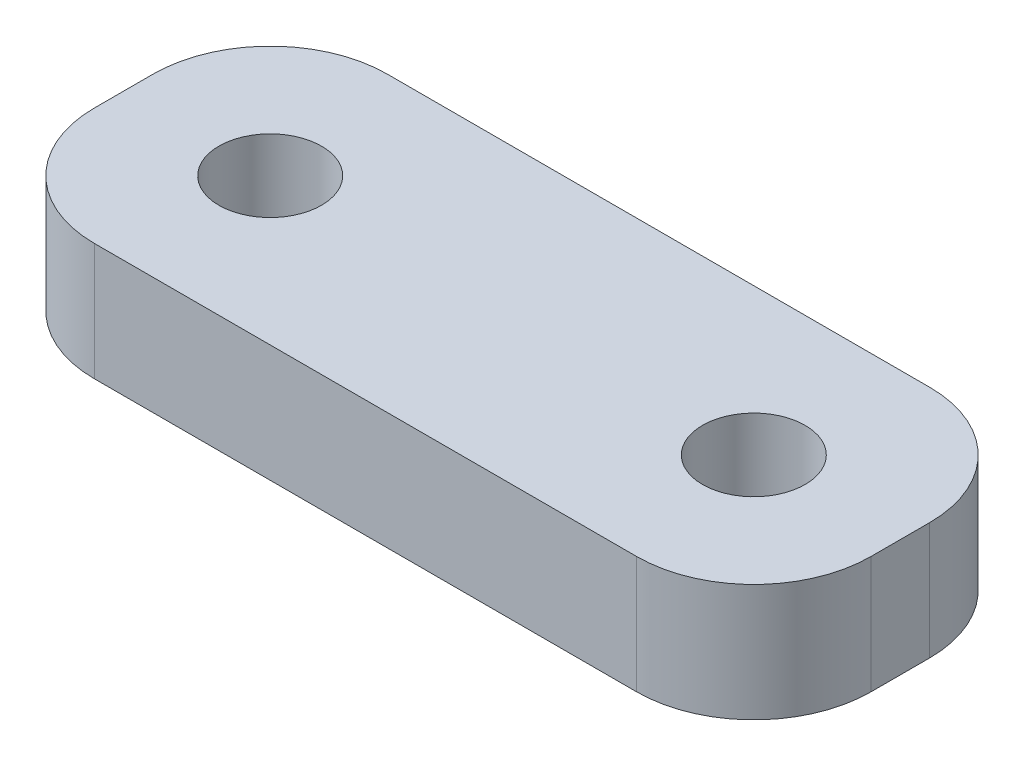
ISO-10303-21;
HEADER;
FILE_DESCRIPTION(('STEP AP214'),'2;1');
FILE_NAME('part.step','',(''),(''),'','','');
FILE_SCHEMA(('AUTOMOTIVE_DESIGN { 1 0 10303 214 1 1 1 1 }'));
ENDSEC;
DATA;
#1=APPLICATION_CONTEXT('core data for automotive mechanical design processes');
#2=APPLICATION_PROTOCOL_DEFINITION('international standard','automotive_design',2000,#1);
#3=PRODUCT_CONTEXT('',#1,'mechanical');
#4=PRODUCT('Part','Part','',(#3));
#5=PRODUCT_RELATED_PRODUCT_CATEGORY('part','',(#4));
#6=PRODUCT_DEFINITION_FORMATION('','',#4);
#7=PRODUCT_DEFINITION_CONTEXT('part definition',#1,'design');
#8=PRODUCT_DEFINITION('design','',#6,#7);
#9=PRODUCT_DEFINITION_SHAPE('','',#8);
#10=(LENGTH_UNIT() NAMED_UNIT(*) SI_UNIT(.MILLI.,.METRE.));
#11=(NAMED_UNIT(*) PLANE_ANGLE_UNIT() SI_UNIT($,.RADIAN.));
#12=(NAMED_UNIT(*) SI_UNIT($,.STERADIAN.) SOLID_ANGLE_UNIT());
#13=UNCERTAINTY_MEASURE_WITH_UNIT(LENGTH_MEASURE(1.E-05),#10,'distance_accuracy_value','');
#14=(GEOMETRIC_REPRESENTATION_CONTEXT(3) GLOBAL_UNCERTAINTY_ASSIGNED_CONTEXT((#13)) GLOBAL_UNIT_ASSIGNED_CONTEXT((#10,
#11,#12)) REPRESENTATION_CONTEXT('',''));
#15=CARTESIAN_POINT('',(0.,0.,0.));
#16=DIRECTION('',(0.,0.,1.));
#17=DIRECTION('',(1.,0.,0.));
#18=AXIS2_PLACEMENT_3D('',#15,#16,#17);
#19=CARTESIAN_POINT('',(0.,4.,0.));
#20=DIRECTION('',(0.,-1.,0.));
#21=DIRECTION('',(0.,0.,-1.));
#22=AXIS2_PLACEMENT_3D('',#19,#20,#21);
#23=PLANE('',#22);
#24=DIRECTION('',(0.,0.,-1.));
#25=VECTOR('',#24,1.);
#26=CARTESIAN_POINT('',(26.5,4.,0.));
#27=LINE('',#26,#25);
#28=CARTESIAN_POINT('',(26.5,4.,-4.));
#29=VERTEX_POINT('',#28);
#30=CARTESIAN_POINT('',(26.5,4.,-6.00000000000001));
#31=VERTEX_POINT('',#30);
#32=EDGE_CURVE('E180',#29,#31,#27,.T.);
#33=ORIENTED_EDGE('',*,*,#32,.T.);
#34=CARTESIAN_POINT('',(22.5,4.,-6.00000000000001));
#35=DIRECTION('',(0.,-1.,0.));
#36=DIRECTION('',(0.,0.,-1.));
#37=AXIS2_PLACEMENT_3D('',#34,#35,#36);
#38=CIRCLE('',#37,4.);
#39=CARTESIAN_POINT('',(22.5,4.,-10.));
#40=VERTEX_POINT('',#39);
#41=EDGE_CURVE('E154',#31,#40,#38,.F.);
#42=ORIENTED_EDGE('',*,*,#41,.T.);
#43=DIRECTION('',(-1.,0.,0.));
#44=VECTOR('',#43,1.);
#45=CARTESIAN_POINT('',(0.,4.,-10.));
#46=LINE('',#45,#44);
#47=CARTESIAN_POINT('',(4.,4.,-10.));
#48=VERTEX_POINT('',#47);
#49=EDGE_CURVE('E127',#40,#48,#46,.T.);
#50=ORIENTED_EDGE('',*,*,#49,.T.);
#51=CARTESIAN_POINT('',(4.,4.,-6.00000000000001));
#52=DIRECTION('',(0.,-1.,0.));
#53=DIRECTION('',(0.,0.,-1.));
#54=AXIS2_PLACEMENT_3D('',#51,#52,#53);
#55=CIRCLE('',#54,4.);
#56=CARTESIAN_POINT('',(0.,4.,-6.00000000000001));
#57=VERTEX_POINT('',#56);
#58=EDGE_CURVE('E151',#48,#57,#55,.F.);
#59=ORIENTED_EDGE('',*,*,#58,.T.);
#60=DIRECTION('',(0.,0.,1.));
#61=VECTOR('',#60,1.);
#62=CARTESIAN_POINT('',(0.,4.,0.));
#63=LINE('',#62,#61);
#64=CARTESIAN_POINT('',(0.,4.,-4.));
#65=VERTEX_POINT('',#64);
#66=EDGE_CURVE('E133',#57,#65,#63,.T.);
#67=ORIENTED_EDGE('',*,*,#66,.T.);
#68=CARTESIAN_POINT('',(4.,4.,-4.));
#69=DIRECTION('',(0.,-1.,0.));
#70=DIRECTION('',(0.,0.,-1.));
#71=AXIS2_PLACEMENT_3D('',#68,#69,#70);
#72=CIRCLE('',#71,4.);
#73=CARTESIAN_POINT('',(4.,4.,0.));
#74=VERTEX_POINT('',#73);
#75=EDGE_CURVE('E64',#65,#74,#72,.F.);
#76=ORIENTED_EDGE('',*,*,#75,.T.);
#77=DIRECTION('',(1.,0.,0.));
#78=VECTOR('',#77,1.);
#79=CARTESIAN_POINT('',(0.,4.,0.));
#80=LINE('',#79,#78);
#81=CARTESIAN_POINT('',(22.5,4.,0.));
#82=VERTEX_POINT('',#81);
#83=EDGE_CURVE('E136',#74,#82,#80,.T.);
#84=ORIENTED_EDGE('',*,*,#83,.T.);
#85=CARTESIAN_POINT('',(22.5,4.,-4.));
#86=DIRECTION('',(0.,-1.,0.));
#87=DIRECTION('',(0.,0.,-1.));
#88=AXIS2_PLACEMENT_3D('',#85,#86,#87);
#89=CIRCLE('',#88,4.);
#90=EDGE_CURVE('E153',#82,#29,#89,.F.);
#91=ORIENTED_EDGE('',*,*,#90,.T.);
#92=EDGE_LOOP('',(#33,#42,#50,#59,#67,#76,#84,#91));
#93=FACE_BOUND('',#92,.T.);
#94=CARTESIAN_POINT('',(5.,4.,-5.));
#95=DIRECTION('',(0.,1.,0.));
#96=DIRECTION('',(0.,0.,1.));
#97=AXIS2_PLACEMENT_3D('',#94,#95,#96);
#98=CIRCLE('',#97,1.75000000000001);
#99=CARTESIAN_POINT('',(5.,4.,-3.24999999999999));
#100=VERTEX_POINT('',#99);
#101=EDGE_CURVE('E173',#100,#100,#98,.T.);
#102=ORIENTED_EDGE('',*,*,#101,.F.);
#103=EDGE_LOOP('',(#102));
#104=FACE_BOUND('',#103,.T.);
#105=CARTESIAN_POINT('',(21.5,4.,-5.));
#106=DIRECTION('',(0.,1.,0.));
#107=DIRECTION('',(0.,0.,1.));
#108=AXIS2_PLACEMENT_3D('',#105,#106,#107);
#109=CIRCLE('',#108,1.75000000000001);
#110=CARTESIAN_POINT('',(21.5,4.,-3.25));
#111=VERTEX_POINT('',#110);
#112=EDGE_CURVE('E184',#111,#111,#109,.T.);
#113=ORIENTED_EDGE('',*,*,#112,.F.);
#114=EDGE_LOOP('',(#113));
#115=FACE_BOUND('',#114,.T.);
#116=ADVANCED_FACE('F39',(#93,#104,#115),#23,.F.);
#117=CARTESIAN_POINT('',(0.,0.,0.));
#118=DIRECTION('',(0.,-1.,0.));
#119=DIRECTION('',(0.,0.,-1.));
#120=AXIS2_PLACEMENT_3D('',#117,#118,#119);
#121=PLANE('',#120);
#122=CARTESIAN_POINT('',(5.,0.,-5.));
#123=DIRECTION('',(0.,1.,0.));
#124=DIRECTION('',(0.,0.,1.));
#125=AXIS2_PLACEMENT_3D('',#122,#123,#124);
#126=CIRCLE('',#125,1.75000000000001);
#127=CARTESIAN_POINT('',(5.,0.,-3.24999999999999));
#128=VERTEX_POINT('',#127);
#129=EDGE_CURVE('E182',#128,#128,#126,.T.);
#130=ORIENTED_EDGE('',*,*,#129,.T.);
#131=EDGE_LOOP('',(#130));
#132=FACE_BOUND('',#131,.T.);
#133=DIRECTION('',(-1.,0.,0.));
#134=VECTOR('',#133,1.);
#135=CARTESIAN_POINT('',(0.,0.,-10.));
#136=LINE('',#135,#134);
#137=CARTESIAN_POINT('',(22.5,0.,-10.));
#138=VERTEX_POINT('',#137);
#139=CARTESIAN_POINT('',(4.,0.,-10.));
#140=VERTEX_POINT('',#139);
#141=EDGE_CURVE('E125',#138,#140,#136,.T.);
#142=ORIENTED_EDGE('',*,*,#141,.F.);
#143=CARTESIAN_POINT('',(22.5,0.,-6.00000000000001));
#144=DIRECTION('',(0.,-1.,0.));
#145=DIRECTION('',(0.,0.,-1.));
#146=AXIS2_PLACEMENT_3D('',#143,#144,#145);
#147=CIRCLE('',#146,4.);
#148=CARTESIAN_POINT('',(26.5,0.,-6.00000000000001));
#149=VERTEX_POINT('',#148);
#150=EDGE_CURVE('E106',#138,#149,#147,.T.);
#151=ORIENTED_EDGE('',*,*,#150,.T.);
#152=DIRECTION('',(0.,0.,-1.));
#153=VECTOR('',#152,1.);
#154=CARTESIAN_POINT('',(26.5,0.,0.));
#155=LINE('',#154,#153);
#156=CARTESIAN_POINT('',(26.5,0.,-4.));
#157=VERTEX_POINT('',#156);
#158=EDGE_CURVE('E132',#157,#149,#155,.T.);
#159=ORIENTED_EDGE('',*,*,#158,.F.);
#160=CARTESIAN_POINT('',(22.5,0.,-4.));
#161=DIRECTION('',(0.,-1.,0.));
#162=DIRECTION('',(0.,0.,-1.));
#163=AXIS2_PLACEMENT_3D('',#160,#161,#162);
#164=CIRCLE('',#163,4.);
#165=CARTESIAN_POINT('',(22.5,0.,0.));
#166=VERTEX_POINT('',#165);
#167=EDGE_CURVE('E116',#157,#166,#164,.T.);
#168=ORIENTED_EDGE('',*,*,#167,.T.);
#169=DIRECTION('',(1.,0.,0.));
#170=VECTOR('',#169,1.);
#171=CARTESIAN_POINT('',(0.,0.,0.));
#172=LINE('',#171,#170);
#173=CARTESIAN_POINT('',(4.,0.,0.));
#174=VERTEX_POINT('',#173);
#175=EDGE_CURVE('E138',#174,#166,#172,.T.);
#176=ORIENTED_EDGE('',*,*,#175,.F.);
#177=CARTESIAN_POINT('',(4.,0.,-4.));
#178=DIRECTION('',(0.,-1.,0.));
#179=DIRECTION('',(0.,0.,-1.));
#180=AXIS2_PLACEMENT_3D('',#177,#178,#179);
#181=CIRCLE('',#180,4.);
#182=CARTESIAN_POINT('',(0.,0.,-4.));
#183=VERTEX_POINT('',#182);
#184=EDGE_CURVE('E130',#174,#183,#181,.T.);
#185=ORIENTED_EDGE('',*,*,#184,.T.);
#186=DIRECTION('',(0.,0.,1.));
#187=VECTOR('',#186,1.);
#188=CARTESIAN_POINT('',(0.,0.,0.));
#189=LINE('',#188,#187);
#190=CARTESIAN_POINT('',(0.,0.,-6.00000000000001));
#191=VERTEX_POINT('',#190);
#192=EDGE_CURVE('E167',#191,#183,#189,.T.);
#193=ORIENTED_EDGE('',*,*,#192,.F.);
#194=CARTESIAN_POINT('',(4.,0.,-6.00000000000001));
#195=DIRECTION('',(0.,-1.,0.));
#196=DIRECTION('',(0.,0.,-1.));
#197=AXIS2_PLACEMENT_3D('',#194,#195,#196);
#198=CIRCLE('',#197,4.);
#199=EDGE_CURVE('E135',#191,#140,#198,.T.);
#200=ORIENTED_EDGE('',*,*,#199,.T.);
#201=EDGE_LOOP('',(#142,#151,#159,#168,#176,#185,#193,#200));
#202=FACE_BOUND('',#201,.T.);
#203=CARTESIAN_POINT('',(21.5,0.,-5.));
#204=DIRECTION('',(0.,1.,0.));
#205=DIRECTION('',(0.,0.,1.));
#206=AXIS2_PLACEMENT_3D('',#203,#204,#205);
#207=CIRCLE('',#206,1.75000000000001);
#208=CARTESIAN_POINT('',(21.5,0.,-3.25));
#209=VERTEX_POINT('',#208);
#210=EDGE_CURVE('E186',#209,#209,#207,.T.);
#211=ORIENTED_EDGE('',*,*,#210,.T.);
#212=EDGE_LOOP('',(#211));
#213=FACE_BOUND('',#212,.T.);
#214=ADVANCED_FACE('F128',(#132,#202,#213),#121,.T.);
#215=CARTESIAN_POINT('',(0.,4.,0.));
#216=DIRECTION('',(1.,0.,0.));
#217=DIRECTION('',(0.,0.,-1.));
#218=AXIS2_PLACEMENT_3D('',#215,#216,#217);
#219=PLANE('',#218);
#220=ORIENTED_EDGE('',*,*,#66,.F.);
#221=DIRECTION('',(0.,-1.,0.));
#222=VECTOR('',#221,1.);
#223=CARTESIAN_POINT('',(0.,4.,-6.00000000000001));
#224=LINE('',#223,#222);
#225=EDGE_CURVE('E11',#57,#191,#224,.T.);
#226=ORIENTED_EDGE('',*,*,#225,.T.);
#227=ORIENTED_EDGE('',*,*,#192,.T.);
#228=DIRECTION('',(0.,-1.,0.));
#229=VECTOR('',#228,1.);
#230=CARTESIAN_POINT('',(0.,4.,-4.));
#231=LINE('',#230,#229);
#232=EDGE_CURVE('E50',#183,#65,#231,.F.);
#233=ORIENTED_EDGE('',*,*,#232,.T.);
#234=EDGE_LOOP('',(#220,#226,#227,#233));
#235=FACE_BOUND('',#234,.T.);
#236=ADVANCED_FACE('F163',(#235),#219,.F.);
#237=CARTESIAN_POINT('',(0.,4.,0.));
#238=DIRECTION('',(0.,0.,-1.));
#239=DIRECTION('',(-1.,0.,0.));
#240=AXIS2_PLACEMENT_3D('',#237,#238,#239);
#241=PLANE('',#240);
#242=ORIENTED_EDGE('',*,*,#175,.T.);
#243=DIRECTION('',(0.,-1.,0.));
#244=VECTOR('',#243,1.);
#245=CARTESIAN_POINT('',(22.5,4.,0.));
#246=LINE('',#245,#244);
#247=EDGE_CURVE('E53',#166,#82,#246,.F.);
#248=ORIENTED_EDGE('',*,*,#247,.T.);
#249=ORIENTED_EDGE('',*,*,#83,.F.);
#250=DIRECTION('',(0.,-1.,0.));
#251=VECTOR('',#250,1.);
#252=CARTESIAN_POINT('',(4.,4.,0.));
#253=LINE('',#252,#251);
#254=EDGE_CURVE('E160',#74,#174,#253,.T.);
#255=ORIENTED_EDGE('',*,*,#254,.T.);
#256=EDGE_LOOP('',(#242,#248,#249,#255));
#257=FACE_BOUND('',#256,.T.);
#258=ADVANCED_FACE('F175',(#257),#241,.F.);
#259=CARTESIAN_POINT('',(26.5,4.,0.));
#260=DIRECTION('',(-1.,0.,0.));
#261=DIRECTION('',(0.,0.,1.));
#262=AXIS2_PLACEMENT_3D('',#259,#260,#261);
#263=PLANE('',#262);
#264=ORIENTED_EDGE('',*,*,#158,.T.);
#265=DIRECTION('',(0.,-1.,0.));
#266=VECTOR('',#265,1.);
#267=CARTESIAN_POINT('',(26.5,4.,-6.00000000000001));
#268=LINE('',#267,#266);
#269=EDGE_CURVE('E112',#149,#31,#268,.F.);
#270=ORIENTED_EDGE('',*,*,#269,.T.);
#271=ORIENTED_EDGE('',*,*,#32,.F.);
#272=DIRECTION('',(0.,-1.,0.));
#273=VECTOR('',#272,1.);
#274=CARTESIAN_POINT('',(26.5,4.,-4.));
#275=LINE('',#274,#273);
#276=EDGE_CURVE('E119',#29,#157,#275,.T.);
#277=ORIENTED_EDGE('',*,*,#276,.T.);
#278=EDGE_LOOP('',(#264,#270,#271,#277));
#279=FACE_BOUND('',#278,.T.);
#280=ADVANCED_FACE('F209',(#279),#263,.F.);
#281=CARTESIAN_POINT('',(0.,4.,-10.));
#282=DIRECTION('',(0.,0.,1.));
#283=DIRECTION('',(1.,0.,0.));
#284=AXIS2_PLACEMENT_3D('',#281,#282,#283);
#285=PLANE('',#284);
#286=ORIENTED_EDGE('',*,*,#49,.F.);
#287=DIRECTION('',(0.,-1.,0.));
#288=VECTOR('',#287,1.);
#289=CARTESIAN_POINT('',(22.5,4.,-10.));
#290=LINE('',#289,#288);
#291=EDGE_CURVE('E109',#40,#138,#290,.T.);
#292=ORIENTED_EDGE('',*,*,#291,.T.);
#293=ORIENTED_EDGE('',*,*,#141,.T.);
#294=DIRECTION('',(0.,-1.,0.));
#295=VECTOR('',#294,1.);
#296=CARTESIAN_POINT('',(4.,4.,-10.));
#297=LINE('',#296,#295);
#298=EDGE_CURVE('E126',#140,#48,#297,.F.);
#299=ORIENTED_EDGE('',*,*,#298,.T.);
#300=EDGE_LOOP('',(#286,#292,#293,#299));
#301=FACE_BOUND('',#300,.T.);
#302=ADVANCED_FACE('F121',(#301),#285,.F.);
#303=CARTESIAN_POINT('',(5.,4.,-5.));
#304=DIRECTION('',(0.,-1.,0.));
#305=DIRECTION('',(0.,0.,-1.));
#306=AXIS2_PLACEMENT_3D('',#303,#304,#305);
#307=CYLINDRICAL_SURFACE('',#306,1.75000000000001);
#308=ORIENTED_EDGE('',*,*,#101,.T.);
#309=EDGE_LOOP('',(#308));
#310=FACE_BOUND('',#309,.T.);
#311=ORIENTED_EDGE('',*,*,#129,.F.);
#312=EDGE_LOOP('',(#311));
#313=FACE_BOUND('',#312,.T.);
#314=ADVANCED_FACE('F202',(#310,#313),#307,.F.);
#315=CARTESIAN_POINT('',(21.5,4.,-5.));
#316=DIRECTION('',(0.,-1.,0.));
#317=DIRECTION('',(0.,0.,-1.));
#318=AXIS2_PLACEMENT_3D('',#315,#316,#317);
#319=CYLINDRICAL_SURFACE('',#318,1.75000000000001);
#320=ORIENTED_EDGE('',*,*,#112,.T.);
#321=EDGE_LOOP('',(#320));
#322=FACE_BOUND('',#321,.T.);
#323=ORIENTED_EDGE('',*,*,#210,.F.);
#324=EDGE_LOOP('',(#323));
#325=FACE_BOUND('',#324,.T.);
#326=ADVANCED_FACE('F195',(#322,#325),#319,.F.);
#327=CARTESIAN_POINT('',(22.5,4.,-6.00000000000001));
#328=DIRECTION('',(0.,-1.,0.));
#329=DIRECTION('',(0.,0.,-1.));
#330=AXIS2_PLACEMENT_3D('',#327,#328,#329);
#331=CYLINDRICAL_SURFACE('',#330,4.);
#332=ORIENTED_EDGE('',*,*,#41,.F.);
#333=ORIENTED_EDGE('',*,*,#269,.F.);
#334=ORIENTED_EDGE('',*,*,#150,.F.);
#335=ORIENTED_EDGE('',*,*,#291,.F.);
#336=EDGE_LOOP('',(#332,#333,#334,#335));
#337=FACE_BOUND('',#336,.T.);
#338=ADVANCED_FACE('F108',(#337),#331,.T.);
#339=CARTESIAN_POINT('',(22.5,4.,-4.));
#340=DIRECTION('',(0.,-1.,0.));
#341=DIRECTION('',(0.,0.,-1.));
#342=AXIS2_PLACEMENT_3D('',#339,#340,#341);
#343=CYLINDRICAL_SURFACE('',#342,4.);
#344=ORIENTED_EDGE('',*,*,#90,.F.);
#345=ORIENTED_EDGE('',*,*,#247,.F.);
#346=ORIENTED_EDGE('',*,*,#167,.F.);
#347=ORIENTED_EDGE('',*,*,#276,.F.);
#348=EDGE_LOOP('',(#344,#345,#346,#347));
#349=FACE_BOUND('',#348,.T.);
#350=ADVANCED_FACE('F219',(#349),#343,.T.);
#351=CARTESIAN_POINT('',(4.,4.,-6.00000000000001));
#352=DIRECTION('',(0.,-1.,0.));
#353=DIRECTION('',(0.,0.,-1.));
#354=AXIS2_PLACEMENT_3D('',#351,#352,#353);
#355=CYLINDRICAL_SURFACE('',#354,4.);
#356=ORIENTED_EDGE('',*,*,#58,.F.);
#357=ORIENTED_EDGE('',*,*,#298,.F.);
#358=ORIENTED_EDGE('',*,*,#199,.F.);
#359=ORIENTED_EDGE('',*,*,#225,.F.);
#360=EDGE_LOOP('',(#356,#357,#358,#359));
#361=FACE_BOUND('',#360,.T.);
#362=ADVANCED_FACE('F225',(#361),#355,.T.);
#363=CARTESIAN_POINT('',(4.,4.,-4.));
#364=DIRECTION('',(0.,-1.,0.));
#365=DIRECTION('',(0.,0.,-1.));
#366=AXIS2_PLACEMENT_3D('',#363,#364,#365);
#367=CYLINDRICAL_SURFACE('',#366,4.);
#368=ORIENTED_EDGE('',*,*,#75,.F.);
#369=ORIENTED_EDGE('',*,*,#232,.F.);
#370=ORIENTED_EDGE('',*,*,#184,.F.);
#371=ORIENTED_EDGE('',*,*,#254,.F.);
#372=EDGE_LOOP('',(#368,#369,#370,#371));
#373=FACE_BOUND('',#372,.T.);
#374=ADVANCED_FACE('F41',(#373),#367,.T.);
#375=CLOSED_SHELL('',(#116,#214,#236,#258,#280,#302,#314,#326,#338,#350,#362,#374));
#376=MANIFOLD_SOLID_BREP('B2',#375);
#377=ADVANCED_BREP_SHAPE_REPRESENTATION('',(#18,#376),#14);
#378=SHAPE_DEFINITION_REPRESENTATION(#9,#377);
ENDSEC;
END-ISO-10303-21;
